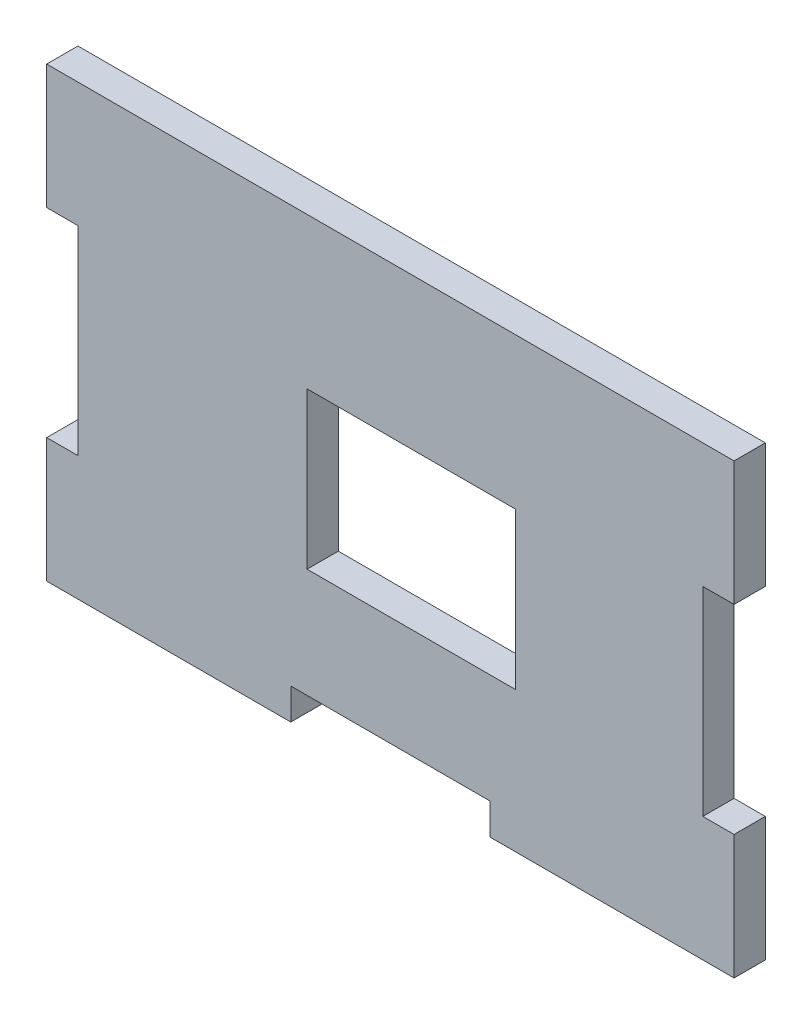
ISO-10303-21;
HEADER;
FILE_DESCRIPTION(('STEP AP214'),'2;1');
FILE_NAME('part.step','',(''),(''),'','','');
FILE_SCHEMA(('AUTOMOTIVE_DESIGN { 1 0 10303 214 1 1 1 1 }'));
ENDSEC;
DATA;
#1=APPLICATION_CONTEXT('core data for automotive mechanical design processes');
#2=APPLICATION_PROTOCOL_DEFINITION('international standard','automotive_design',2000,#1);
#3=PRODUCT_CONTEXT('',#1,'mechanical');
#4=PRODUCT('Part','Part','',(#3));
#5=PRODUCT_RELATED_PRODUCT_CATEGORY('part','',(#4));
#6=PRODUCT_DEFINITION_FORMATION('','',#4);
#7=PRODUCT_DEFINITION_CONTEXT('part definition',#1,'design');
#8=PRODUCT_DEFINITION('design','',#6,#7);
#9=PRODUCT_DEFINITION_SHAPE('','',#8);
#10=(LENGTH_UNIT() NAMED_UNIT(*) SI_UNIT(.MILLI.,.METRE.));
#11=(NAMED_UNIT(*) PLANE_ANGLE_UNIT() SI_UNIT($,.RADIAN.));
#12=(NAMED_UNIT(*) SI_UNIT($,.STERADIAN.) SOLID_ANGLE_UNIT());
#13=UNCERTAINTY_MEASURE_WITH_UNIT(LENGTH_MEASURE(1.E-05),#10,'distance_accuracy_value','');
#14=(GEOMETRIC_REPRESENTATION_CONTEXT(3) GLOBAL_UNCERTAINTY_ASSIGNED_CONTEXT((#13)) GLOBAL_UNIT_ASSIGNED_CONTEXT((#10,
#11,#12)) REPRESENTATION_CONTEXT('',''));
#15=CARTESIAN_POINT('',(0.,0.,0.));
#16=DIRECTION('',(0.,0.,1.));
#17=DIRECTION('',(1.,0.,0.));
#18=AXIS2_PLACEMENT_3D('',#15,#16,#17);
#19=CARTESIAN_POINT('',(107.712301942412,-55.5636997090602,3.));
#20=DIRECTION('',(-1.,0.,0.));
#21=DIRECTION('',(0.,0.,1.));
#22=AXIS2_PLACEMENT_3D('',#19,#20,#21);
#23=PLANE('',#22);
#24=DIRECTION('',(0.,1.,0.));
#25=VECTOR('',#24,1.);
#26=CARTESIAN_POINT('',(107.712301942412,-55.5636997090602,0.));
#27=LINE('',#26,#25);
#28=CARTESIAN_POINT('',(107.712301942412,-55.5636997090602,0.));
#29=VERTEX_POINT('',#28);
#30=CARTESIAN_POINT('',(107.712301942412,-43.6261997090601,0.));
#31=VERTEX_POINT('',#30);
#32=EDGE_CURVE('E198',#29,#31,#27,.T.);
#33=ORIENTED_EDGE('',*,*,#32,.T.);
#34=DIRECTION('',(0.,0.,-1.));
#35=VECTOR('',#34,1.);
#36=CARTESIAN_POINT('',(107.712301942412,-43.6261997090601,3.));
#37=LINE('',#36,#35);
#38=CARTESIAN_POINT('',(107.712301942412,-43.6261997090601,3.));
#39=VERTEX_POINT('',#38);
#40=EDGE_CURVE('E312',#39,#31,#37,.T.);
#41=ORIENTED_EDGE('',*,*,#40,.F.);
#42=DIRECTION('',(0.,1.,0.));
#43=VECTOR('',#42,1.);
#44=CARTESIAN_POINT('',(107.712301942412,-55.5636997090602,3.));
#45=LINE('',#44,#43);
#46=CARTESIAN_POINT('',(107.712301942412,-55.5636997090602,3.));
#47=VERTEX_POINT('',#46);
#48=EDGE_CURVE('E201',#47,#39,#45,.T.);
#49=ORIENTED_EDGE('',*,*,#48,.F.);
#50=DIRECTION('',(0.,0.,-1.));
#51=VECTOR('',#50,1.);
#52=CARTESIAN_POINT('',(107.712301942412,-55.5636997090602,3.));
#53=LINE('',#52,#51);
#54=EDGE_CURVE('E235',#47,#29,#53,.T.);
#55=ORIENTED_EDGE('',*,*,#54,.T.);
#56=EDGE_LOOP('',(#33,#41,#49,#55));
#57=FACE_BOUND('',#56,.T.);
#58=ADVANCED_FACE('F36',(#57),#23,.F.);
#59=CARTESIAN_POINT('',(107.712301942412,-43.6261997090601,3.));
#60=DIRECTION('',(0.,-1.,0.));
#61=DIRECTION('',(0.,0.,-1.));
#62=AXIS2_PLACEMENT_3D('',#59,#60,#61);
#63=PLANE('',#62);
#64=DIRECTION('',(-1.,0.,0.));
#65=VECTOR('',#64,1.);
#66=CARTESIAN_POINT('',(107.712301942412,-43.6261997090601,0.));
#67=LINE('',#66,#65);
#68=CARTESIAN_POINT('',(41.712301942412,-43.6261997090601,0.));
#69=VERTEX_POINT('',#68);
#70=EDGE_CURVE('E238',#31,#69,#67,.T.);
#71=ORIENTED_EDGE('',*,*,#70,.T.);
#72=DIRECTION('',(0.,0.,-1.));
#73=VECTOR('',#72,1.);
#74=CARTESIAN_POINT('',(41.712301942412,-43.6261997090601,3.));
#75=LINE('',#74,#73);
#76=CARTESIAN_POINT('',(41.712301942412,-43.6261997090601,3.));
#77=VERTEX_POINT('',#76);
#78=EDGE_CURVE('E309',#77,#69,#75,.T.);
#79=ORIENTED_EDGE('',*,*,#78,.F.);
#80=DIRECTION('',(-1.,0.,0.));
#81=VECTOR('',#80,1.);
#82=CARTESIAN_POINT('',(107.712301942412,-43.6261997090601,3.));
#83=LINE('',#82,#81);
#84=EDGE_CURVE('E204',#39,#77,#83,.T.);
#85=ORIENTED_EDGE('',*,*,#84,.F.);
#86=ORIENTED_EDGE('',*,*,#40,.T.);
#87=EDGE_LOOP('',(#71,#79,#85,#86));
#88=FACE_BOUND('',#87,.T.);
#89=ADVANCED_FACE('F336',(#88),#63,.F.);
#90=CARTESIAN_POINT('',(41.712301942412,-43.6261997090601,3.));
#91=DIRECTION('',(1.,0.,0.));
#92=DIRECTION('',(0.,0.,-1.));
#93=AXIS2_PLACEMENT_3D('',#90,#91,#92);
#94=PLANE('',#93);
#95=DIRECTION('',(0.,-1.,0.));
#96=VECTOR('',#95,1.);
#97=CARTESIAN_POINT('',(41.712301942412,-43.6261997090601,0.));
#98=LINE('',#97,#96);
#99=CARTESIAN_POINT('',(41.712301942412,-55.5636997090602,0.));
#100=VERTEX_POINT('',#99);
#101=EDGE_CURVE('E240',#69,#100,#98,.T.);
#102=ORIENTED_EDGE('',*,*,#101,.T.);
#103=DIRECTION('',(0.,0.,-1.));
#104=VECTOR('',#103,1.);
#105=CARTESIAN_POINT('',(41.712301942412,-55.5636997090602,3.));
#106=LINE('',#105,#104);
#107=CARTESIAN_POINT('',(41.712301942412,-55.5636997090602,3.));
#108=VERTEX_POINT('',#107);
#109=EDGE_CURVE('E306',#108,#100,#106,.T.);
#110=ORIENTED_EDGE('',*,*,#109,.F.);
#111=DIRECTION('',(0.,-1.,0.));
#112=VECTOR('',#111,1.);
#113=CARTESIAN_POINT('',(41.712301942412,-43.6261997090601,3.));
#114=LINE('',#113,#112);
#115=EDGE_CURVE('E207',#77,#108,#114,.T.);
#116=ORIENTED_EDGE('',*,*,#115,.F.);
#117=ORIENTED_EDGE('',*,*,#78,.T.);
#118=EDGE_LOOP('',(#102,#110,#116,#117));
#119=FACE_BOUND('',#118,.T.);
#120=ADVANCED_FACE('F341',(#119),#94,.F.);
#121=CARTESIAN_POINT('',(41.712301942412,-55.5636997090602,3.));
#122=DIRECTION('',(0.,1.,0.));
#123=DIRECTION('',(0.,0.,1.));
#124=AXIS2_PLACEMENT_3D('',#121,#122,#123);
#125=PLANE('',#124);
#126=DIRECTION('',(1.,0.,0.));
#127=VECTOR('',#126,1.);
#128=CARTESIAN_POINT('',(41.712301942412,-55.5636997090602,0.));
#129=LINE('',#128,#127);
#130=CARTESIAN_POINT('',(44.712301942412,-55.5636997090602,0.));
#131=VERTEX_POINT('',#130);
#132=EDGE_CURVE('E242',#100,#131,#129,.T.);
#133=ORIENTED_EDGE('',*,*,#132,.T.);
#134=DIRECTION('',(0.,0.,-1.));
#135=VECTOR('',#134,1.);
#136=CARTESIAN_POINT('',(44.712301942412,-55.5636997090602,3.));
#137=LINE('',#136,#135);
#138=CARTESIAN_POINT('',(44.712301942412,-55.5636997090602,3.));
#139=VERTEX_POINT('',#138);
#140=EDGE_CURVE('E303',#139,#131,#137,.T.);
#141=ORIENTED_EDGE('',*,*,#140,.F.);
#142=DIRECTION('',(1.,0.,0.));
#143=VECTOR('',#142,1.);
#144=CARTESIAN_POINT('',(41.712301942412,-55.5636997090602,3.));
#145=LINE('',#144,#143);
#146=EDGE_CURVE('E209',#108,#139,#145,.T.);
#147=ORIENTED_EDGE('',*,*,#146,.F.);
#148=ORIENTED_EDGE('',*,*,#109,.T.);
#149=EDGE_LOOP('',(#133,#141,#147,#148));
#150=FACE_BOUND('',#149,.T.);
#151=ADVANCED_FACE('F412',(#150),#125,.F.);
#152=CARTESIAN_POINT('',(44.712301942412,-55.5636997090602,3.));
#153=DIRECTION('',(1.,0.,0.));
#154=DIRECTION('',(0.,0.,-1.));
#155=AXIS2_PLACEMENT_3D('',#152,#153,#154);
#156=PLANE('',#155);
#157=DIRECTION('',(0.,-1.,0.));
#158=VECTOR('',#157,1.);
#159=CARTESIAN_POINT('',(44.712301942412,-55.5636997090602,0.));
#160=LINE('',#159,#158);
#161=CARTESIAN_POINT('',(44.712301942412,-74.6886997090601,0.));
#162=VERTEX_POINT('',#161);
#163=EDGE_CURVE('E244',#131,#162,#160,.T.);
#164=ORIENTED_EDGE('',*,*,#163,.T.);
#165=DIRECTION('',(0.,0.,-1.));
#166=VECTOR('',#165,1.);
#167=CARTESIAN_POINT('',(44.712301942412,-74.6886997090601,3.));
#168=LINE('',#167,#166);
#169=CARTESIAN_POINT('',(44.712301942412,-74.6886997090601,3.));
#170=VERTEX_POINT('',#169);
#171=EDGE_CURVE('E300',#170,#162,#168,.T.);
#172=ORIENTED_EDGE('',*,*,#171,.F.);
#173=DIRECTION('',(0.,-1.,0.));
#174=VECTOR('',#173,1.);
#175=CARTESIAN_POINT('',(44.712301942412,-55.5636997090602,3.));
#176=LINE('',#175,#174);
#177=EDGE_CURVE('E211',#139,#170,#176,.T.);
#178=ORIENTED_EDGE('',*,*,#177,.F.);
#179=ORIENTED_EDGE('',*,*,#140,.T.);
#180=EDGE_LOOP('',(#164,#172,#178,#179));
#181=FACE_BOUND('',#180,.T.);
#182=ADVANCED_FACE('F408',(#181),#156,.F.);
#183=CARTESIAN_POINT('',(44.712301942412,-74.6886997090601,3.));
#184=DIRECTION('',(0.,-1.,0.));
#185=DIRECTION('',(0.,0.,-1.));
#186=AXIS2_PLACEMENT_3D('',#183,#184,#185);
#187=PLANE('',#186);
#188=DIRECTION('',(-1.,0.,0.));
#189=VECTOR('',#188,1.);
#190=CARTESIAN_POINT('',(44.712301942412,-74.6886997090601,0.));
#191=LINE('',#190,#189);
#192=CARTESIAN_POINT('',(41.712301942412,-74.6886997090601,0.));
#193=VERTEX_POINT('',#192);
#194=EDGE_CURVE('E246',#162,#193,#191,.T.);
#195=ORIENTED_EDGE('',*,*,#194,.T.);
#196=DIRECTION('',(0.,0.,-1.));
#197=VECTOR('',#196,1.);
#198=CARTESIAN_POINT('',(41.712301942412,-74.6886997090601,3.));
#199=LINE('',#198,#197);
#200=CARTESIAN_POINT('',(41.712301942412,-74.6886997090601,3.));
#201=VERTEX_POINT('',#200);
#202=EDGE_CURVE('E297',#201,#193,#199,.T.);
#203=ORIENTED_EDGE('',*,*,#202,.F.);
#204=DIRECTION('',(-1.,0.,0.));
#205=VECTOR('',#204,1.);
#206=CARTESIAN_POINT('',(44.712301942412,-74.6886997090601,3.));
#207=LINE('',#206,#205);
#208=EDGE_CURVE('E213',#170,#201,#207,.T.);
#209=ORIENTED_EDGE('',*,*,#208,.F.);
#210=ORIENTED_EDGE('',*,*,#171,.T.);
#211=EDGE_LOOP('',(#195,#203,#209,#210));
#212=FACE_BOUND('',#211,.T.);
#213=ADVANCED_FACE('F403',(#212),#187,.F.);
#214=CARTESIAN_POINT('',(41.712301942412,-74.6886997090601,3.));
#215=DIRECTION('',(1.,0.,0.));
#216=DIRECTION('',(0.,0.,-1.));
#217=AXIS2_PLACEMENT_3D('',#214,#215,#216);
#218=PLANE('',#217);
#219=DIRECTION('',(0.,-1.,0.));
#220=VECTOR('',#219,1.);
#221=CARTESIAN_POINT('',(41.712301942412,-74.6886997090601,0.));
#222=LINE('',#221,#220);
#223=CARTESIAN_POINT('',(41.712301942412,-86.6261997090601,0.));
#224=VERTEX_POINT('',#223);
#225=EDGE_CURVE('E248',#193,#224,#222,.T.);
#226=ORIENTED_EDGE('',*,*,#225,.T.);
#227=DIRECTION('',(0.,0.,-1.));
#228=VECTOR('',#227,1.);
#229=CARTESIAN_POINT('',(41.712301942412,-86.6261997090601,3.));
#230=LINE('',#229,#228);
#231=CARTESIAN_POINT('',(41.712301942412,-86.6261997090601,3.));
#232=VERTEX_POINT('',#231);
#233=EDGE_CURVE('E294',#232,#224,#230,.T.);
#234=ORIENTED_EDGE('',*,*,#233,.F.);
#235=DIRECTION('',(0.,-1.,0.));
#236=VECTOR('',#235,1.);
#237=CARTESIAN_POINT('',(41.712301942412,-74.6886997090601,3.));
#238=LINE('',#237,#236);
#239=EDGE_CURVE('E215',#201,#232,#238,.T.);
#240=ORIENTED_EDGE('',*,*,#239,.F.);
#241=ORIENTED_EDGE('',*,*,#202,.T.);
#242=EDGE_LOOP('',(#226,#234,#240,#241));
#243=FACE_BOUND('',#242,.T.);
#244=ADVANCED_FACE('F398',(#243),#218,.F.);
#245=CARTESIAN_POINT('',(41.712301942412,-86.6261997090601,3.));
#246=DIRECTION('',(0.,1.,0.));
#247=DIRECTION('',(0.,0.,1.));
#248=AXIS2_PLACEMENT_3D('',#245,#246,#247);
#249=PLANE('',#248);
#250=DIRECTION('',(1.,0.,0.));
#251=VECTOR('',#250,1.);
#252=CARTESIAN_POINT('',(41.712301942412,-86.6261997090601,0.));
#253=LINE('',#252,#251);
#254=CARTESIAN_POINT('',(65.149801942412,-86.6261997090601,0.));
#255=VERTEX_POINT('',#254);
#256=EDGE_CURVE('E250',#224,#255,#253,.T.);
#257=ORIENTED_EDGE('',*,*,#256,.T.);
#258=DIRECTION('',(0.,0.,-1.));
#259=VECTOR('',#258,1.);
#260=CARTESIAN_POINT('',(65.149801942412,-86.6261997090601,3.));
#261=LINE('',#260,#259);
#262=CARTESIAN_POINT('',(65.149801942412,-86.6261997090601,3.));
#263=VERTEX_POINT('',#262);
#264=EDGE_CURVE('E291',#263,#255,#261,.T.);
#265=ORIENTED_EDGE('',*,*,#264,.F.);
#266=DIRECTION('',(1.,0.,0.));
#267=VECTOR('',#266,1.);
#268=CARTESIAN_POINT('',(41.712301942412,-86.6261997090601,3.));
#269=LINE('',#268,#267);
#270=EDGE_CURVE('E217',#232,#263,#269,.T.);
#271=ORIENTED_EDGE('',*,*,#270,.F.);
#272=ORIENTED_EDGE('',*,*,#233,.T.);
#273=EDGE_LOOP('',(#257,#265,#271,#272));
#274=FACE_BOUND('',#273,.T.);
#275=ADVANCED_FACE('F394',(#274),#249,.F.);
#276=CARTESIAN_POINT('',(65.149801942412,-86.6261997090601,3.));
#277=DIRECTION('',(-1.,0.,0.));
#278=DIRECTION('',(0.,0.,1.));
#279=AXIS2_PLACEMENT_3D('',#276,#277,#278);
#280=PLANE('',#279);
#281=DIRECTION('',(0.,1.,0.));
#282=VECTOR('',#281,1.);
#283=CARTESIAN_POINT('',(65.149801942412,-86.6261997090601,0.));
#284=LINE('',#283,#282);
#285=CARTESIAN_POINT('',(65.149801942412,-83.6261997090601,0.));
#286=VERTEX_POINT('',#285);
#287=EDGE_CURVE('E252',#255,#286,#284,.T.);
#288=ORIENTED_EDGE('',*,*,#287,.T.);
#289=DIRECTION('',(0.,0.,-1.));
#290=VECTOR('',#289,1.);
#291=CARTESIAN_POINT('',(65.149801942412,-83.6261997090601,3.));
#292=LINE('',#291,#290);
#293=CARTESIAN_POINT('',(65.149801942412,-83.6261997090601,3.));
#294=VERTEX_POINT('',#293);
#295=EDGE_CURVE('E288',#294,#286,#292,.T.);
#296=ORIENTED_EDGE('',*,*,#295,.F.);
#297=DIRECTION('',(0.,1.,0.));
#298=VECTOR('',#297,1.);
#299=CARTESIAN_POINT('',(65.149801942412,-86.6261997090601,3.));
#300=LINE('',#299,#298);
#301=EDGE_CURVE('E219',#263,#294,#300,.T.);
#302=ORIENTED_EDGE('',*,*,#301,.F.);
#303=ORIENTED_EDGE('',*,*,#264,.T.);
#304=EDGE_LOOP('',(#288,#296,#302,#303));
#305=FACE_BOUND('',#304,.T.);
#306=ADVANCED_FACE('F389',(#305),#280,.F.);
#307=CARTESIAN_POINT('',(65.149801942412,-83.6261997090601,3.));
#308=DIRECTION('',(0.,1.,0.));
#309=DIRECTION('',(0.,0.,1.));
#310=AXIS2_PLACEMENT_3D('',#307,#308,#309);
#311=PLANE('',#310);
#312=DIRECTION('',(1.,0.,0.));
#313=VECTOR('',#312,1.);
#314=CARTESIAN_POINT('',(65.149801942412,-83.6261997090601,0.));
#315=LINE('',#314,#313);
#316=CARTESIAN_POINT('',(84.274801942412,-83.6261997090601,0.));
#317=VERTEX_POINT('',#316);
#318=EDGE_CURVE('E254',#286,#317,#315,.T.);
#319=ORIENTED_EDGE('',*,*,#318,.T.);
#320=DIRECTION('',(0.,0.,-1.));
#321=VECTOR('',#320,1.);
#322=CARTESIAN_POINT('',(84.274801942412,-83.6261997090601,3.));
#323=LINE('',#322,#321);
#324=CARTESIAN_POINT('',(84.274801942412,-83.6261997090601,3.));
#325=VERTEX_POINT('',#324);
#326=EDGE_CURVE('E285',#325,#317,#323,.T.);
#327=ORIENTED_EDGE('',*,*,#326,.F.);
#328=DIRECTION('',(1.,0.,0.));
#329=VECTOR('',#328,1.);
#330=CARTESIAN_POINT('',(65.149801942412,-83.6261997090601,3.));
#331=LINE('',#330,#329);
#332=EDGE_CURVE('E221',#294,#325,#331,.T.);
#333=ORIENTED_EDGE('',*,*,#332,.F.);
#334=ORIENTED_EDGE('',*,*,#295,.T.);
#335=EDGE_LOOP('',(#319,#327,#333,#334));
#336=FACE_BOUND('',#335,.T.);
#337=ADVANCED_FACE('F383',(#336),#311,.F.);
#338=CARTESIAN_POINT('',(84.274801942412,-83.6261997090601,3.));
#339=DIRECTION('',(1.,0.,0.));
#340=DIRECTION('',(0.,0.,-1.));
#341=AXIS2_PLACEMENT_3D('',#338,#339,#340);
#342=PLANE('',#341);
#343=DIRECTION('',(0.,-1.,0.));
#344=VECTOR('',#343,1.);
#345=CARTESIAN_POINT('',(84.274801942412,-83.6261997090601,0.));
#346=LINE('',#345,#344);
#347=CARTESIAN_POINT('',(84.274801942412,-86.6261997090601,0.));
#348=VERTEX_POINT('',#347);
#349=EDGE_CURVE('E256',#317,#348,#346,.T.);
#350=ORIENTED_EDGE('',*,*,#349,.T.);
#351=DIRECTION('',(0.,0.,-1.));
#352=VECTOR('',#351,1.);
#353=CARTESIAN_POINT('',(84.274801942412,-86.6261997090601,3.));
#354=LINE('',#353,#352);
#355=CARTESIAN_POINT('',(84.274801942412,-86.6261997090601,3.));
#356=VERTEX_POINT('',#355);
#357=EDGE_CURVE('E282',#356,#348,#354,.T.);
#358=ORIENTED_EDGE('',*,*,#357,.F.);
#359=DIRECTION('',(0.,-1.,0.));
#360=VECTOR('',#359,1.);
#361=CARTESIAN_POINT('',(84.274801942412,-83.6261997090601,3.));
#362=LINE('',#361,#360);
#363=EDGE_CURVE('E223',#325,#356,#362,.T.);
#364=ORIENTED_EDGE('',*,*,#363,.F.);
#365=ORIENTED_EDGE('',*,*,#326,.T.);
#366=EDGE_LOOP('',(#350,#358,#364,#365));
#367=FACE_BOUND('',#366,.T.);
#368=ADVANCED_FACE('F378',(#367),#342,.F.);
#369=CARTESIAN_POINT('',(103.399801942412,-86.6261997090601,3.));
#370=DIRECTION('',(0.,1.,0.));
#371=DIRECTION('',(0.,0.,1.));
#372=AXIS2_PLACEMENT_3D('',#369,#370,#371);
#373=PLANE('',#372);
#374=DIRECTION('',(1.,0.,0.));
#375=VECTOR('',#374,1.);
#376=CARTESIAN_POINT('',(103.399801942412,-86.6261997090601,0.));
#377=LINE('',#376,#375);
#378=CARTESIAN_POINT('',(107.712301942412,-86.6261997090601,0.));
#379=VERTEX_POINT('',#378);
#380=EDGE_CURVE('E259',#348,#379,#377,.T.);
#381=ORIENTED_EDGE('',*,*,#380,.T.);
#382=DIRECTION('',(0.,0.,-1.));
#383=VECTOR('',#382,1.);
#384=CARTESIAN_POINT('',(107.712301942412,-86.6261997090601,3.));
#385=LINE('',#384,#383);
#386=CARTESIAN_POINT('',(107.712301942412,-86.6261997090601,3.));
#387=VERTEX_POINT('',#386);
#388=EDGE_CURVE('E279',#387,#379,#385,.T.);
#389=ORIENTED_EDGE('',*,*,#388,.F.);
#390=DIRECTION('',(1.,0.,0.));
#391=VECTOR('',#390,1.);
#392=CARTESIAN_POINT('',(84.274801942412,-86.6261997090601,3.));
#393=LINE('',#392,#391);
#394=EDGE_CURVE('E225',#356,#387,#393,.T.);
#395=ORIENTED_EDGE('',*,*,#394,.F.);
#396=ORIENTED_EDGE('',*,*,#357,.T.);
#397=EDGE_LOOP('',(#381,#389,#395,#396));
#398=FACE_BOUND('',#397,.T.);
#399=ADVANCED_FACE('F373',(#398),#373,.F.);
#400=CARTESIAN_POINT('',(107.712301942412,-86.6261997090601,3.));
#401=DIRECTION('',(-1.,0.,0.));
#402=DIRECTION('',(0.,0.,1.));
#403=AXIS2_PLACEMENT_3D('',#400,#401,#402);
#404=PLANE('',#403);
#405=DIRECTION('',(0.,1.,0.));
#406=VECTOR('',#405,1.);
#407=CARTESIAN_POINT('',(107.712301942412,-86.6261997090601,0.));
#408=LINE('',#407,#406);
#409=CARTESIAN_POINT('',(107.712301942412,-74.6886997090601,0.));
#410=VERTEX_POINT('',#409);
#411=EDGE_CURVE('E261',#379,#410,#408,.T.);
#412=ORIENTED_EDGE('',*,*,#411,.T.);
#413=DIRECTION('',(0.,0.,-1.));
#414=VECTOR('',#413,1.);
#415=CARTESIAN_POINT('',(107.712301942412,-74.6886997090601,3.));
#416=LINE('',#415,#414);
#417=CARTESIAN_POINT('',(107.712301942412,-74.6886997090601,3.));
#418=VERTEX_POINT('',#417);
#419=EDGE_CURVE('E276',#418,#410,#416,.T.);
#420=ORIENTED_EDGE('',*,*,#419,.F.);
#421=DIRECTION('',(0.,1.,0.));
#422=VECTOR('',#421,1.);
#423=CARTESIAN_POINT('',(107.712301942412,-86.6261997090601,3.));
#424=LINE('',#423,#422);
#425=EDGE_CURVE('E227',#387,#418,#424,.T.);
#426=ORIENTED_EDGE('',*,*,#425,.F.);
#427=ORIENTED_EDGE('',*,*,#388,.T.);
#428=EDGE_LOOP('',(#412,#420,#426,#427));
#429=FACE_BOUND('',#428,.T.);
#430=ADVANCED_FACE('F369',(#429),#404,.F.);
#431=CARTESIAN_POINT('',(107.712301942412,-74.6886997090601,3.));
#432=DIRECTION('',(0.,-1.,0.));
#433=DIRECTION('',(0.,0.,-1.));
#434=AXIS2_PLACEMENT_3D('',#431,#432,#433);
#435=PLANE('',#434);
#436=DIRECTION('',(-1.,0.,0.));
#437=VECTOR('',#436,1.);
#438=CARTESIAN_POINT('',(107.712301942412,-74.6886997090601,0.));
#439=LINE('',#438,#437);
#440=CARTESIAN_POINT('',(104.712301942412,-74.6886997090601,0.));
#441=VERTEX_POINT('',#440);
#442=EDGE_CURVE('E263',#410,#441,#439,.T.);
#443=ORIENTED_EDGE('',*,*,#442,.T.);
#444=DIRECTION('',(0.,0.,-1.));
#445=VECTOR('',#444,1.);
#446=CARTESIAN_POINT('',(104.712301942412,-74.6886997090601,3.));
#447=LINE('',#446,#445);
#448=CARTESIAN_POINT('',(104.712301942412,-74.6886997090601,3.));
#449=VERTEX_POINT('',#448);
#450=EDGE_CURVE('E273',#449,#441,#447,.T.);
#451=ORIENTED_EDGE('',*,*,#450,.F.);
#452=DIRECTION('',(-1.,0.,0.));
#453=VECTOR('',#452,1.);
#454=CARTESIAN_POINT('',(107.712301942412,-74.6886997090601,3.));
#455=LINE('',#454,#453);
#456=EDGE_CURVE('E229',#418,#449,#455,.T.);
#457=ORIENTED_EDGE('',*,*,#456,.F.);
#458=ORIENTED_EDGE('',*,*,#419,.T.);
#459=EDGE_LOOP('',(#443,#451,#457,#458));
#460=FACE_BOUND('',#459,.T.);
#461=ADVANCED_FACE('F364',(#460),#435,.F.);
#462=CARTESIAN_POINT('',(104.712301942412,-74.6886997090601,3.));
#463=DIRECTION('',(-1.,0.,0.));
#464=DIRECTION('',(0.,0.,1.));
#465=AXIS2_PLACEMENT_3D('',#462,#463,#464);
#466=PLANE('',#465);
#467=DIRECTION('',(0.,1.,0.));
#468=VECTOR('',#467,1.);
#469=CARTESIAN_POINT('',(104.712301942412,-74.6886997090601,0.));
#470=LINE('',#469,#468);
#471=CARTESIAN_POINT('',(104.712301942412,-55.5636997090602,0.));
#472=VERTEX_POINT('',#471);
#473=EDGE_CURVE('E265',#441,#472,#470,.T.);
#474=ORIENTED_EDGE('',*,*,#473,.T.);
#475=DIRECTION('',(0.,0.,-1.));
#476=VECTOR('',#475,1.);
#477=CARTESIAN_POINT('',(104.712301942412,-55.5636997090602,3.));
#478=LINE('',#477,#476);
#479=CARTESIAN_POINT('',(104.712301942412,-55.5636997090602,3.));
#480=VERTEX_POINT('',#479);
#481=EDGE_CURVE('E270',#480,#472,#478,.T.);
#482=ORIENTED_EDGE('',*,*,#481,.F.);
#483=DIRECTION('',(0.,1.,0.));
#484=VECTOR('',#483,1.);
#485=CARTESIAN_POINT('',(104.712301942412,-74.6886997090601,3.));
#486=LINE('',#485,#484);
#487=EDGE_CURVE('E231',#449,#480,#486,.T.);
#488=ORIENTED_EDGE('',*,*,#487,.F.);
#489=ORIENTED_EDGE('',*,*,#450,.T.);
#490=EDGE_LOOP('',(#474,#482,#488,#489));
#491=FACE_BOUND('',#490,.T.);
#492=ADVANCED_FACE('F359',(#491),#466,.F.);
#493=CARTESIAN_POINT('',(104.712301942412,-55.5636997090602,3.));
#494=DIRECTION('',(0.,1.,0.));
#495=DIRECTION('',(0.,0.,1.));
#496=AXIS2_PLACEMENT_3D('',#493,#494,#495);
#497=PLANE('',#496);
#498=DIRECTION('',(1.,0.,0.));
#499=VECTOR('',#498,1.);
#500=CARTESIAN_POINT('',(104.712301942412,-55.5636997090602,0.));
#501=LINE('',#500,#499);
#502=EDGE_CURVE('E205',#472,#29,#501,.T.);
#503=ORIENTED_EDGE('',*,*,#502,.T.);
#504=ORIENTED_EDGE('',*,*,#54,.F.);
#505=DIRECTION('',(1.,0.,0.));
#506=VECTOR('',#505,1.);
#507=CARTESIAN_POINT('',(104.712301942412,-55.5636997090602,3.));
#508=LINE('',#507,#506);
#509=EDGE_CURVE('E233',#480,#47,#508,.T.);
#510=ORIENTED_EDGE('',*,*,#509,.F.);
#511=ORIENTED_EDGE('',*,*,#481,.T.);
#512=EDGE_LOOP('',(#503,#504,#510,#511));
#513=FACE_BOUND('',#512,.T.);
#514=ADVANCED_FACE('F357',(#513),#497,.F.);
#515=CARTESIAN_POINT('',(0.,0.,3.));
#516=DIRECTION('',(0.,0.,1.));
#517=DIRECTION('',(1.,0.,0.));
#518=AXIS2_PLACEMENT_3D('',#515,#516,#517);
#519=PLANE('',#518);
#520=DIRECTION('',(0.,-1.,0.));
#521=VECTOR('',#520,1.);
#522=CARTESIAN_POINT('',(66.712301942412,-58.1327287494958,3.));
#523=LINE('',#522,#521);
#524=CARTESIAN_POINT('',(66.712301942412,-58.1327287494958,3.));
#525=VERTEX_POINT('',#524);
#526=CARTESIAN_POINT('',(66.712301942412,-73.1327287494958,3.));
#527=VERTEX_POINT('',#526);
#528=EDGE_CURVE('E50',#525,#527,#523,.T.);
#529=ORIENTED_EDGE('',*,*,#528,.F.);
#530=DIRECTION('',(-1.,0.,0.));
#531=VECTOR('',#530,1.);
#532=CARTESIAN_POINT('',(66.712301942412,-58.1327287494958,3.));
#533=LINE('',#532,#531);
#534=CARTESIAN_POINT('',(86.712301942412,-58.1327287494958,3.));
#535=VERTEX_POINT('',#534);
#536=EDGE_CURVE('E191',#535,#525,#533,.T.);
#537=ORIENTED_EDGE('',*,*,#536,.F.);
#538=DIRECTION('',(0.,1.,0.));
#539=VECTOR('',#538,1.);
#540=CARTESIAN_POINT('',(86.712301942412,-58.1327287494958,3.));
#541=LINE('',#540,#539);
#542=CARTESIAN_POINT('',(86.712301942412,-73.1327287494958,3.));
#543=VERTEX_POINT('',#542);
#544=EDGE_CURVE('E175',#543,#535,#541,.T.);
#545=ORIENTED_EDGE('',*,*,#544,.F.);
#546=DIRECTION('',(1.,0.,0.));
#547=VECTOR('',#546,1.);
#548=CARTESIAN_POINT('',(66.712301942412,-73.1327287494958,3.));
#549=LINE('',#548,#547);
#550=EDGE_CURVE('E184',#527,#543,#549,.T.);
#551=ORIENTED_EDGE('',*,*,#550,.F.);
#552=EDGE_LOOP('',(#529,#537,#545,#551));
#553=FACE_BOUND('',#552,.T.);
#554=ORIENTED_EDGE('',*,*,#48,.T.);
#555=ORIENTED_EDGE('',*,*,#84,.T.);
#556=ORIENTED_EDGE('',*,*,#115,.T.);
#557=ORIENTED_EDGE('',*,*,#146,.T.);
#558=ORIENTED_EDGE('',*,*,#177,.T.);
#559=ORIENTED_EDGE('',*,*,#208,.T.);
#560=ORIENTED_EDGE('',*,*,#239,.T.);
#561=ORIENTED_EDGE('',*,*,#270,.T.);
#562=ORIENTED_EDGE('',*,*,#301,.T.);
#563=ORIENTED_EDGE('',*,*,#332,.T.);
#564=ORIENTED_EDGE('',*,*,#363,.T.);
#565=ORIENTED_EDGE('',*,*,#394,.T.);
#566=ORIENTED_EDGE('',*,*,#425,.T.);
#567=ORIENTED_EDGE('',*,*,#456,.T.);
#568=ORIENTED_EDGE('',*,*,#487,.T.);
#569=ORIENTED_EDGE('',*,*,#509,.T.);
#570=EDGE_LOOP('',(#554,#555,#556,#557,#558,#559,#560,#561,#562,#563,#564,#565,#566,#567,#568,#569));
#571=FACE_BOUND('',#570,.T.);
#572=ADVANCED_FACE('F188',(#553,#571),#519,.T.);
#573=CARTESIAN_POINT('',(0.,0.,0.));
#574=DIRECTION('',(0.,0.,1.));
#575=DIRECTION('',(1.,0.,0.));
#576=AXIS2_PLACEMENT_3D('',#573,#574,#575);
#577=PLANE('',#576);
#578=DIRECTION('',(-1.,0.,0.));
#579=VECTOR('',#578,1.);
#580=CARTESIAN_POINT('',(0.,-58.1327287494958,0.));
#581=LINE('',#580,#579);
#582=CARTESIAN_POINT('',(86.712301942412,-58.1327287494958,0.));
#583=VERTEX_POINT('',#582);
#584=CARTESIAN_POINT('',(66.712301942412,-58.1327287494958,0.));
#585=VERTEX_POINT('',#584);
#586=EDGE_CURVE('E43',#583,#585,#581,.T.);
#587=ORIENTED_EDGE('',*,*,#586,.T.);
#588=DIRECTION('',(0.,-1.,0.));
#589=VECTOR('',#588,1.);
#590=CARTESIAN_POINT('',(66.712301942412,0.,0.));
#591=LINE('',#590,#589);
#592=CARTESIAN_POINT('',(66.712301942412,-73.1327287494958,0.));
#593=VERTEX_POINT('',#592);
#594=EDGE_CURVE('E11',#585,#593,#591,.T.);
#595=ORIENTED_EDGE('',*,*,#594,.T.);
#596=DIRECTION('',(1.,0.,0.));
#597=VECTOR('',#596,1.);
#598=CARTESIAN_POINT('',(0.,-73.1327287494958,0.));
#599=LINE('',#598,#597);
#600=CARTESIAN_POINT('',(86.712301942412,-73.1327287494958,0.));
#601=VERTEX_POINT('',#600);
#602=EDGE_CURVE('E315',#593,#601,#599,.T.);
#603=ORIENTED_EDGE('',*,*,#602,.T.);
#604=DIRECTION('',(0.,1.,0.));
#605=VECTOR('',#604,1.);
#606=CARTESIAN_POINT('',(86.7123019424121,0.,0.));
#607=LINE('',#606,#605);
#608=EDGE_CURVE('E178',#601,#583,#607,.T.);
#609=ORIENTED_EDGE('',*,*,#608,.T.);
#610=EDGE_LOOP('',(#587,#595,#603,#609));
#611=FACE_BOUND('',#610,.T.);
#612=ORIENTED_EDGE('',*,*,#32,.F.);
#613=ORIENTED_EDGE('',*,*,#502,.F.);
#614=ORIENTED_EDGE('',*,*,#473,.F.);
#615=ORIENTED_EDGE('',*,*,#442,.F.);
#616=ORIENTED_EDGE('',*,*,#411,.F.);
#617=ORIENTED_EDGE('',*,*,#380,.F.);
#618=ORIENTED_EDGE('',*,*,#349,.F.);
#619=ORIENTED_EDGE('',*,*,#318,.F.);
#620=ORIENTED_EDGE('',*,*,#287,.F.);
#621=ORIENTED_EDGE('',*,*,#256,.F.);
#622=ORIENTED_EDGE('',*,*,#225,.F.);
#623=ORIENTED_EDGE('',*,*,#194,.F.);
#624=ORIENTED_EDGE('',*,*,#163,.F.);
#625=ORIENTED_EDGE('',*,*,#132,.F.);
#626=ORIENTED_EDGE('',*,*,#101,.F.);
#627=ORIENTED_EDGE('',*,*,#70,.F.);
#628=EDGE_LOOP('',(#612,#613,#614,#615,#616,#617,#618,#619,#620,#621,#622,#623,#624,#625,#626,#627));
#629=FACE_BOUND('',#628,.T.);
#630=ADVANCED_FACE('F319',(#611,#629),#577,.F.);
#631=CARTESIAN_POINT('',(66.712301942412,-58.1327287494958,-7.));
#632=DIRECTION('',(-1.,0.,0.));
#633=DIRECTION('',(0.,0.,1.));
#634=AXIS2_PLACEMENT_3D('',#631,#632,#633);
#635=PLANE('',#634);
#636=DIRECTION('',(0.,0.,1.));
#637=VECTOR('',#636,1.);
#638=CARTESIAN_POINT('',(66.712301942412,-58.1327287494958,-7.));
#639=LINE('',#638,#637);
#640=EDGE_CURVE('E196',#585,#525,#639,.T.);
#641=ORIENTED_EDGE('',*,*,#640,.T.);
#642=ORIENTED_EDGE('',*,*,#528,.T.);
#643=DIRECTION('',(0.,0.,1.));
#644=VECTOR('',#643,1.);
#645=CARTESIAN_POINT('',(66.712301942412,-73.1327287494958,-7.));
#646=LINE('',#645,#644);
#647=EDGE_CURVE('E181',#593,#527,#646,.T.);
#648=ORIENTED_EDGE('',*,*,#647,.F.);
#649=ORIENTED_EDGE('',*,*,#594,.F.);
#650=EDGE_LOOP('',(#641,#642,#648,#649));
#651=FACE_BOUND('',#650,.T.);
#652=ADVANCED_FACE('F324',(#651),#635,.F.);
#653=CARTESIAN_POINT('',(66.712301942412,-58.1327287494958,-7.));
#654=DIRECTION('',(0.,1.,0.));
#655=DIRECTION('',(0.,0.,1.));
#656=AXIS2_PLACEMENT_3D('',#653,#654,#655);
#657=PLANE('',#656);
#658=DIRECTION('',(0.,0.,1.));
#659=VECTOR('',#658,1.);
#660=CARTESIAN_POINT('',(86.712301942412,-58.1327287494958,-7.));
#661=LINE('',#660,#659);
#662=EDGE_CURVE('E180',#583,#535,#661,.T.);
#663=ORIENTED_EDGE('',*,*,#662,.T.);
#664=ORIENTED_EDGE('',*,*,#536,.T.);
#665=ORIENTED_EDGE('',*,*,#640,.F.);
#666=ORIENTED_EDGE('',*,*,#586,.F.);
#667=EDGE_LOOP('',(#663,#664,#665,#666));
#668=FACE_BOUND('',#667,.T.);
#669=ADVANCED_FACE('F323',(#668),#657,.F.);
#670=CARTESIAN_POINT('',(86.712301942412,-58.1327287494958,-7.));
#671=DIRECTION('',(1.,0.,0.));
#672=DIRECTION('',(0.,1.,0.));
#673=AXIS2_PLACEMENT_3D('',#670,#671,#672);
#674=PLANE('',#673);
#675=DIRECTION('',(0.,0.,1.));
#676=VECTOR('',#675,1.);
#677=CARTESIAN_POINT('',(86.712301942412,-73.1327287494958,-7.));
#678=LINE('',#677,#676);
#679=EDGE_CURVE('E58',#601,#543,#678,.T.);
#680=ORIENTED_EDGE('',*,*,#679,.T.);
#681=ORIENTED_EDGE('',*,*,#544,.T.);
#682=ORIENTED_EDGE('',*,*,#662,.F.);
#683=ORIENTED_EDGE('',*,*,#608,.F.);
#684=EDGE_LOOP('',(#680,#681,#682,#683));
#685=FACE_BOUND('',#684,.T.);
#686=ADVANCED_FACE('F172',(#685),#674,.F.);
#687=CARTESIAN_POINT('',(66.712301942412,-73.1327287494958,-7.));
#688=DIRECTION('',(0.,-1.,0.));
#689=DIRECTION('',(0.,0.,-1.));
#690=AXIS2_PLACEMENT_3D('',#687,#688,#689);
#691=PLANE('',#690);
#692=ORIENTED_EDGE('',*,*,#647,.T.);
#693=ORIENTED_EDGE('',*,*,#550,.T.);
#694=ORIENTED_EDGE('',*,*,#679,.F.);
#695=ORIENTED_EDGE('',*,*,#602,.F.);
#696=EDGE_LOOP('',(#692,#693,#694,#695));
#697=FACE_BOUND('',#696,.T.);
#698=ADVANCED_FACE('F185',(#697),#691,.F.);
#699=CLOSED_SHELL('',(#58,#89,#120,#151,#182,#213,#244,#275,#306,#337,#368,#399,#430,#461,#492,
#514,#572,#630,#652,#669,#686,#698));
#700=MANIFOLD_SOLID_BREP('B2',#699);
#701=ADVANCED_BREP_SHAPE_REPRESENTATION('',(#18,#700),#14);
#702=SHAPE_DEFINITION_REPRESENTATION(#9,#701);
ENDSEC;
END-ISO-10303-21;
